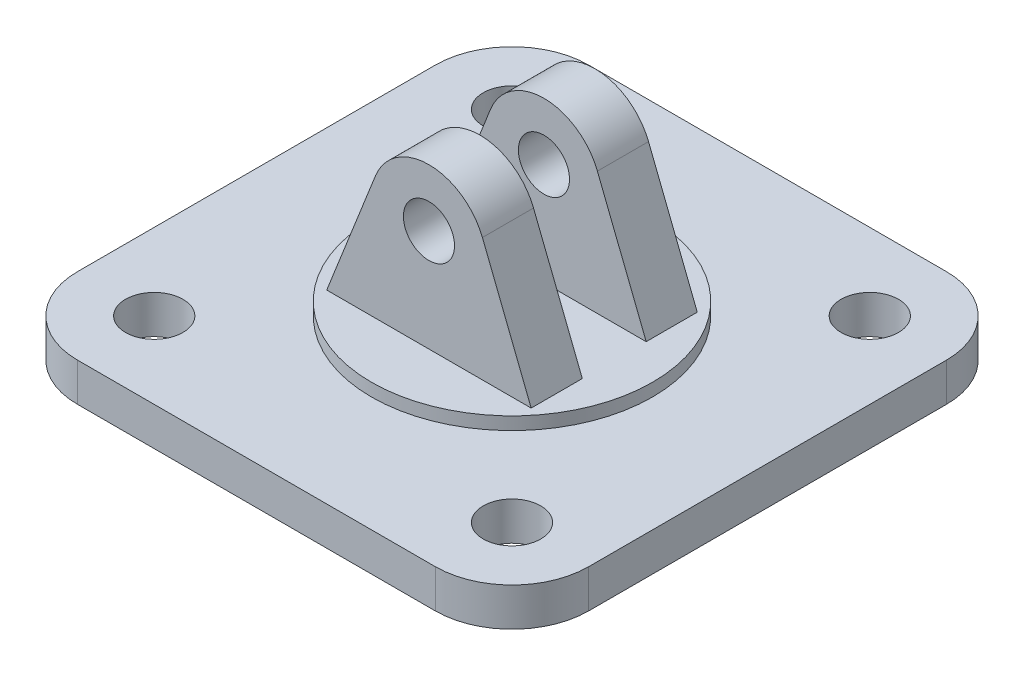
ISO-10303-21;
HEADER;
FILE_DESCRIPTION(('STEP AP214'),'2;1');
FILE_NAME('part.step','',(''),(''),'','','');
FILE_SCHEMA(('AUTOMOTIVE_DESIGN { 1 0 10303 214 1 1 1 1 }'));
ENDSEC;
DATA;
#1=APPLICATION_CONTEXT('core data for automotive mechanical design processes');
#2=APPLICATION_PROTOCOL_DEFINITION('international standard','automotive_design',2000,#1);
#3=PRODUCT_CONTEXT('',#1,'mechanical');
#4=PRODUCT('Part','Part','',(#3));
#5=PRODUCT_RELATED_PRODUCT_CATEGORY('part','',(#4));
#6=PRODUCT_DEFINITION_FORMATION('','',#4);
#7=PRODUCT_DEFINITION_CONTEXT('part definition',#1,'design');
#8=PRODUCT_DEFINITION('design','',#6,#7);
#9=PRODUCT_DEFINITION_SHAPE('','',#8);
#10=(LENGTH_UNIT() NAMED_UNIT(*) SI_UNIT(.MILLI.,.METRE.));
#11=(NAMED_UNIT(*) PLANE_ANGLE_UNIT() SI_UNIT($,.RADIAN.));
#12=(NAMED_UNIT(*) SI_UNIT($,.STERADIAN.) SOLID_ANGLE_UNIT());
#13=UNCERTAINTY_MEASURE_WITH_UNIT(LENGTH_MEASURE(1.E-05),#10,'distance_accuracy_value','');
#14=(GEOMETRIC_REPRESENTATION_CONTEXT(3) GLOBAL_UNCERTAINTY_ASSIGNED_CONTEXT((#13)) GLOBAL_UNIT_ASSIGNED_CONTEXT((#10,
#11,#12)) REPRESENTATION_CONTEXT('',''));
#15=CARTESIAN_POINT('',(0.,0.,0.));
#16=DIRECTION('',(0.,0.,1.));
#17=DIRECTION('',(1.,0.,0.));
#18=AXIS2_PLACEMENT_3D('',#15,#16,#17);
#19=CARTESIAN_POINT('',(-20.,50.,-16.25));
#20=DIRECTION('',(0.,0.,-1.));
#21=DIRECTION('',(-1.,0.,0.));
#22=AXIS2_PLACEMENT_3D('',#19,#20,#21);
#23=PLANE('',#22);
#24=CARTESIAN_POINT('',(0.,30.,-16.25));
#25=DIRECTION('',(0.,0.,1.));
#26=DIRECTION('',(1.,0.,0.));
#27=AXIS2_PLACEMENT_3D('',#24,#25,#26);
#28=CIRCLE('',#27,5.);
#29=CARTESIAN_POINT('',(5.,30.,-16.25));
#30=VERTEX_POINT('',#29);
#31=EDGE_CURVE('E330',#30,#30,#28,.T.);
#32=ORIENTED_EDGE('',*,*,#31,.T.);
#33=EDGE_LOOP('',(#32));
#34=FACE_BOUND('',#33,.T.);
#35=DIRECTION('',(-0.367516859125834,-0.930016859125834,0.));
#36=VECTOR('',#35,1.);
#37=CARTESIAN_POINT('',(-20.7165959151656,8.18662391741718,-16.25));
#38=LINE('',#37,#36);
#39=CARTESIAN_POINT('',(-10.4626896651656,34.1345646651656,-16.25));
#40=VERTEX_POINT('',#39);
#41=CARTESIAN_POINT('',(-20.,10.,-16.25));
#42=VERTEX_POINT('',#41);
#43=EDGE_CURVE('E370',#40,#42,#38,.T.);
#44=ORIENTED_EDGE('',*,*,#43,.F.);
#45=CARTESIAN_POINT('',(0.,30.,-16.25));
#46=DIRECTION('',(0.,0.,1.));
#47=DIRECTION('',(1.,0.,0.));
#48=AXIS2_PLACEMENT_3D('',#45,#46,#47);
#49=CIRCLE('',#48,11.25);
#50=CARTESIAN_POINT('',(10.4626896651656,34.1345646651656,-16.25));
#51=VERTEX_POINT('',#50);
#52=EDGE_CURVE('E349',#51,#40,#49,.T.);
#53=ORIENTED_EDGE('',*,*,#52,.F.);
#54=DIRECTION('',(0.367516859125835,-0.930016859125834,0.));
#55=VECTOR('',#54,1.);
#56=CARTESIAN_POINT('',(20.7165959151656,8.1866239174172,-16.25));
#57=LINE('',#56,#55);
#58=CARTESIAN_POINT('',(20.,10.,-16.25));
#59=VERTEX_POINT('',#58);
#60=EDGE_CURVE('E360',#51,#59,#57,.T.);
#61=ORIENTED_EDGE('',*,*,#60,.T.);
#62=DIRECTION('',(1.,0.,0.));
#63=VECTOR('',#62,1.);
#64=CARTESIAN_POINT('',(-20.,10.,-16.25));
#65=LINE('',#64,#63);
#66=EDGE_CURVE('E385',#42,#59,#65,.T.);
#67=ORIENTED_EDGE('',*,*,#66,.F.);
#68=EDGE_LOOP('',(#44,#53,#61,#67));
#69=FACE_BOUND('',#68,.T.);
#70=ADVANCED_FACE('F87',(#34,#69),#23,.T.);
#71=CARTESIAN_POINT('',(-20.,50.,-6.25));
#72=DIRECTION('',(0.,0.,1.));
#73=DIRECTION('',(1.,0.,0.));
#74=AXIS2_PLACEMENT_3D('',#71,#72,#73);
#75=PLANE('',#74);
#76=CARTESIAN_POINT('',(0.,30.,-6.25));
#77=DIRECTION('',(0.,0.,1.));
#78=DIRECTION('',(1.,0.,0.));
#79=AXIS2_PLACEMENT_3D('',#76,#77,#78);
#80=CIRCLE('',#79,5.);
#81=CARTESIAN_POINT('',(5.,30.,-6.25));
#82=VERTEX_POINT('',#81);
#83=EDGE_CURVE('E344',#82,#82,#80,.T.);
#84=ORIENTED_EDGE('',*,*,#83,.F.);
#85=EDGE_LOOP('',(#84));
#86=FACE_BOUND('',#85,.T.);
#87=DIRECTION('',(0.367516859125835,-0.930016859125834,0.));
#88=VECTOR('',#87,1.);
#89=CARTESIAN_POINT('',(20.7165959151656,8.1866239174172,-6.25));
#90=LINE('',#89,#88);
#91=CARTESIAN_POINT('',(10.4626896651656,34.1345646651656,-6.25));
#92=VERTEX_POINT('',#91);
#93=CARTESIAN_POINT('',(20.,10.,-6.25));
#94=VERTEX_POINT('',#93);
#95=EDGE_CURVE('E359',#92,#94,#90,.T.);
#96=ORIENTED_EDGE('',*,*,#95,.F.);
#97=CARTESIAN_POINT('',(0.,30.,-6.25));
#98=DIRECTION('',(0.,0.,1.));
#99=DIRECTION('',(1.,0.,0.));
#100=AXIS2_PLACEMENT_3D('',#97,#98,#99);
#101=CIRCLE('',#100,11.25);
#102=CARTESIAN_POINT('',(-10.4626896651656,34.1345646651656,-6.25));
#103=VERTEX_POINT('',#102);
#104=EDGE_CURVE('E355',#92,#103,#101,.T.);
#105=ORIENTED_EDGE('',*,*,#104,.T.);
#106=DIRECTION('',(-0.367516859125834,-0.930016859125834,0.));
#107=VECTOR('',#106,1.);
#108=CARTESIAN_POINT('',(-20.7165959151656,8.18662391741718,-6.25));
#109=LINE('',#108,#107);
#110=CARTESIAN_POINT('',(-20.,10.,-6.25));
#111=VERTEX_POINT('',#110);
#112=EDGE_CURVE('E115',#103,#111,#109,.T.);
#113=ORIENTED_EDGE('',*,*,#112,.T.);
#114=DIRECTION('',(-1.,0.,0.));
#115=VECTOR('',#114,1.);
#116=CARTESIAN_POINT('',(-20.,10.,-6.25));
#117=LINE('',#116,#115);
#118=EDGE_CURVE('E388',#94,#111,#117,.T.);
#119=ORIENTED_EDGE('',*,*,#118,.F.);
#120=EDGE_LOOP('',(#96,#105,#113,#119));
#121=FACE_BOUND('',#120,.T.);
#122=ADVANCED_FACE('F609',(#86,#121),#75,.T.);
#123=CARTESIAN_POINT('',(-20.,50.,6.25));
#124=DIRECTION('',(0.,0.,1.));
#125=DIRECTION('',(1.,0.,0.));
#126=AXIS2_PLACEMENT_3D('',#123,#124,#125);
#127=PLANE('',#126);
#128=CARTESIAN_POINT('',(0.,30.,6.25));
#129=DIRECTION('',(0.,0.,1.));
#130=DIRECTION('',(1.,0.,0.));
#131=AXIS2_PLACEMENT_3D('',#128,#129,#130);
#132=CIRCLE('',#131,5.);
#133=CARTESIAN_POINT('',(5.,30.,6.25));
#134=VERTEX_POINT('',#133);
#135=EDGE_CURVE('E393',#134,#134,#132,.T.);
#136=ORIENTED_EDGE('',*,*,#135,.T.);
#137=EDGE_LOOP('',(#136));
#138=FACE_BOUND('',#137,.T.);
#139=DIRECTION('',(-0.367516859125834,-0.930016859125834,0.));
#140=VECTOR('',#139,1.);
#141=CARTESIAN_POINT('',(-20.7165959151656,8.18662391741718,6.25));
#142=LINE('',#141,#140);
#143=CARTESIAN_POINT('',(-10.4626896651656,34.1345646651656,6.25));
#144=VERTEX_POINT('',#143);
#145=CARTESIAN_POINT('',(-20.,10.,6.25));
#146=VERTEX_POINT('',#145);
#147=EDGE_CURVE('E411',#144,#146,#142,.T.);
#148=ORIENTED_EDGE('',*,*,#147,.F.);
#149=CARTESIAN_POINT('',(0.,30.,6.25));
#150=DIRECTION('',(0.,0.,1.));
#151=DIRECTION('',(1.,0.,0.));
#152=AXIS2_PLACEMENT_3D('',#149,#150,#151);
#153=CIRCLE('',#152,11.25);
#154=CARTESIAN_POINT('',(10.4626896651656,34.1345646651656,6.25));
#155=VERTEX_POINT('',#154);
#156=EDGE_CURVE('E401',#155,#144,#153,.T.);
#157=ORIENTED_EDGE('',*,*,#156,.F.);
#158=DIRECTION('',(0.367516859125835,-0.930016859125834,0.));
#159=VECTOR('',#158,1.);
#160=CARTESIAN_POINT('',(20.7165959151656,8.1866239174172,6.25));
#161=LINE('',#160,#159);
#162=CARTESIAN_POINT('',(20.,10.,6.25));
#163=VERTEX_POINT('',#162);
#164=EDGE_CURVE('E407',#155,#163,#161,.T.);
#165=ORIENTED_EDGE('',*,*,#164,.T.);
#166=DIRECTION('',(-1.,0.,0.));
#167=VECTOR('',#166,1.);
#168=CARTESIAN_POINT('',(-20.,10.,6.25));
#169=LINE('',#168,#167);
#170=EDGE_CURVE('E435',#163,#146,#169,.T.);
#171=ORIENTED_EDGE('',*,*,#170,.T.);
#172=EDGE_LOOP('',(#148,#157,#165,#171));
#173=FACE_BOUND('',#172,.T.);
#174=ADVANCED_FACE('F613',(#138,#173),#127,.F.);
#175=CARTESIAN_POINT('',(-20.,50.,16.25));
#176=DIRECTION('',(0.,0.,-1.));
#177=DIRECTION('',(-1.,0.,0.));
#178=AXIS2_PLACEMENT_3D('',#175,#176,#177);
#179=PLANE('',#178);
#180=CARTESIAN_POINT('',(0.,30.,16.25));
#181=DIRECTION('',(0.,0.,1.));
#182=DIRECTION('',(1.,0.,0.));
#183=AXIS2_PLACEMENT_3D('',#180,#181,#182);
#184=CIRCLE('',#183,5.);
#185=CARTESIAN_POINT('',(5.,30.,16.25));
#186=VERTEX_POINT('',#185);
#187=EDGE_CURVE('E391',#186,#186,#184,.T.);
#188=ORIENTED_EDGE('',*,*,#187,.F.);
#189=EDGE_LOOP('',(#188));
#190=FACE_BOUND('',#189,.T.);
#191=DIRECTION('',(0.367516859125835,-0.930016859125834,0.));
#192=VECTOR('',#191,1.);
#193=CARTESIAN_POINT('',(20.7165959151656,8.1866239174172,16.25));
#194=LINE('',#193,#192);
#195=CARTESIAN_POINT('',(10.4626896651656,34.1345646651656,16.25));
#196=VERTEX_POINT('',#195);
#197=CARTESIAN_POINT('',(20.,10.,16.25));
#198=VERTEX_POINT('',#197);
#199=EDGE_CURVE('E416',#196,#198,#194,.T.);
#200=ORIENTED_EDGE('',*,*,#199,.F.);
#201=CARTESIAN_POINT('',(0.,30.,16.25));
#202=DIRECTION('',(0.,0.,1.));
#203=DIRECTION('',(1.,0.,0.));
#204=AXIS2_PLACEMENT_3D('',#201,#202,#203);
#205=CIRCLE('',#204,11.25);
#206=CARTESIAN_POINT('',(-10.4626896651656,34.1345646651656,16.25));
#207=VERTEX_POINT('',#206);
#208=EDGE_CURVE('E398',#196,#207,#205,.T.);
#209=ORIENTED_EDGE('',*,*,#208,.T.);
#210=DIRECTION('',(-0.367516859125834,-0.930016859125834,0.));
#211=VECTOR('',#210,1.);
#212=CARTESIAN_POINT('',(-20.7165959151656,8.18662391741718,16.25));
#213=LINE('',#212,#211);
#214=CARTESIAN_POINT('',(-20.,10.,16.25));
#215=VERTEX_POINT('',#214);
#216=EDGE_CURVE('E409',#207,#215,#213,.T.);
#217=ORIENTED_EDGE('',*,*,#216,.T.);
#218=DIRECTION('',(1.,0.,0.));
#219=VECTOR('',#218,1.);
#220=CARTESIAN_POINT('',(-20.,10.,16.25));
#221=LINE('',#220,#219);
#222=EDGE_CURVE('E438',#215,#198,#221,.T.);
#223=ORIENTED_EDGE('',*,*,#222,.T.);
#224=EDGE_LOOP('',(#200,#209,#217,#223));
#225=FACE_BOUND('',#224,.T.);
#226=ADVANCED_FACE('F636',(#190,#225),#179,.F.);
#227=CARTESIAN_POINT('',(50.,7.5,50.));
#228=DIRECTION('',(-1.,0.,0.));
#229=DIRECTION('',(0.,0.,1.));
#230=AXIS2_PLACEMENT_3D('',#227,#228,#229);
#231=PLANE('',#230);
#232=DIRECTION('',(0.,0.,-1.));
#233=VECTOR('',#232,1.);
#234=CARTESIAN_POINT('',(50.,0.,50.));
#235=LINE('',#234,#233);
#236=CARTESIAN_POINT('',(50.,0.,35.));
#237=VERTEX_POINT('',#236);
#238=CARTESIAN_POINT('',(50.,0.,-35.));
#239=VERTEX_POINT('',#238);
#240=EDGE_CURVE('E478',#237,#239,#235,.T.);
#241=ORIENTED_EDGE('',*,*,#240,.T.);
#242=DIRECTION('',(0.,-1.,0.));
#243=VECTOR('',#242,1.);
#244=CARTESIAN_POINT('',(50.,7.5,-35.));
#245=LINE('',#244,#243);
#246=CARTESIAN_POINT('',(50.,7.5,-35.));
#247=VERTEX_POINT('',#246);
#248=EDGE_CURVE('E554',#239,#247,#245,.F.);
#249=ORIENTED_EDGE('',*,*,#248,.T.);
#250=DIRECTION('',(0.,0.,-1.));
#251=VECTOR('',#250,1.);
#252=CARTESIAN_POINT('',(50.,7.5,50.));
#253=LINE('',#252,#251);
#254=CARTESIAN_POINT('',(50.,7.5,35.));
#255=VERTEX_POINT('',#254);
#256=EDGE_CURVE('E477',#255,#247,#253,.T.);
#257=ORIENTED_EDGE('',*,*,#256,.F.);
#258=DIRECTION('',(0.,-1.,0.));
#259=VECTOR('',#258,1.);
#260=CARTESIAN_POINT('',(50.,7.5,35.));
#261=LINE('',#260,#259);
#262=EDGE_CURVE('E548',#255,#237,#261,.T.);
#263=ORIENTED_EDGE('',*,*,#262,.T.);
#264=EDGE_LOOP('',(#241,#249,#257,#263));
#265=FACE_BOUND('',#264,.T.);
#266=ADVANCED_FACE('F573',(#265),#231,.F.);
#267=CARTESIAN_POINT('',(-50.,7.5,-50.));
#268=DIRECTION('',(0.,0.,1.));
#269=DIRECTION('',(1.,0.,0.));
#270=AXIS2_PLACEMENT_3D('',#267,#268,#269);
#271=PLANE('',#270);
#272=DIRECTION('',(-1.,0.,0.));
#273=VECTOR('',#272,1.);
#274=CARTESIAN_POINT('',(-50.,0.,-50.));
#275=LINE('',#274,#273);
#276=CARTESIAN_POINT('',(35.,0.,-50.));
#277=VERTEX_POINT('',#276);
#278=CARTESIAN_POINT('',(-35.,0.,-50.));
#279=VERTEX_POINT('',#278);
#280=EDGE_CURVE('E502',#277,#279,#275,.T.);
#281=ORIENTED_EDGE('',*,*,#280,.T.);
#282=DIRECTION('',(0.,-1.,0.));
#283=VECTOR('',#282,1.);
#284=CARTESIAN_POINT('',(-35.,7.5,-50.));
#285=LINE('',#284,#283);
#286=CARTESIAN_POINT('',(-35.,7.5,-50.));
#287=VERTEX_POINT('',#286);
#288=EDGE_CURVE('E534',#279,#287,#285,.F.);
#289=ORIENTED_EDGE('',*,*,#288,.T.);
#290=DIRECTION('',(-1.,0.,0.));
#291=VECTOR('',#290,1.);
#292=CARTESIAN_POINT('',(-50.,7.5,-50.));
#293=LINE('',#292,#291);
#294=CARTESIAN_POINT('',(35.,7.5,-50.));
#295=VERTEX_POINT('',#294);
#296=EDGE_CURVE('E482',#295,#287,#293,.T.);
#297=ORIENTED_EDGE('',*,*,#296,.F.);
#298=DIRECTION('',(0.,-1.,0.));
#299=VECTOR('',#298,1.);
#300=CARTESIAN_POINT('',(35.,7.5,-50.));
#301=LINE('',#300,#299);
#302=EDGE_CURVE('E529',#295,#277,#301,.T.);
#303=ORIENTED_EDGE('',*,*,#302,.T.);
#304=EDGE_LOOP('',(#281,#289,#297,#303));
#305=FACE_BOUND('',#304,.T.);
#306=ADVANCED_FACE('F590',(#305),#271,.F.);
#307=CARTESIAN_POINT('',(-50.,7.5,50.));
#308=DIRECTION('',(1.,0.,0.));
#309=DIRECTION('',(0.,0.,-1.));
#310=AXIS2_PLACEMENT_3D('',#307,#308,#309);
#311=PLANE('',#310);
#312=DIRECTION('',(0.,0.,1.));
#313=VECTOR('',#312,1.);
#314=CARTESIAN_POINT('',(-50.,7.5,50.));
#315=LINE('',#314,#313);
#316=CARTESIAN_POINT('',(-50.,7.5,-35.));
#317=VERTEX_POINT('',#316);
#318=CARTESIAN_POINT('',(-50.,7.5,35.));
#319=VERTEX_POINT('',#318);
#320=EDGE_CURVE('E487',#317,#319,#315,.T.);
#321=ORIENTED_EDGE('',*,*,#320,.F.);
#322=DIRECTION('',(0.,-1.,0.));
#323=VECTOR('',#322,1.);
#324=CARTESIAN_POINT('',(-50.,7.5,-35.));
#325=LINE('',#324,#323);
#326=CARTESIAN_POINT('',(-50.,0.,-35.));
#327=VERTEX_POINT('',#326);
#328=EDGE_CURVE('E514',#317,#327,#325,.T.);
#329=ORIENTED_EDGE('',*,*,#328,.T.);
#330=DIRECTION('',(0.,0.,1.));
#331=VECTOR('',#330,1.);
#332=CARTESIAN_POINT('',(-50.,0.,50.));
#333=LINE('',#332,#331);
#334=CARTESIAN_POINT('',(-50.,0.,35.));
#335=VERTEX_POINT('',#334);
#336=EDGE_CURVE('E503',#327,#335,#333,.T.);
#337=ORIENTED_EDGE('',*,*,#336,.T.);
#338=DIRECTION('',(0.,-1.,0.));
#339=VECTOR('',#338,1.);
#340=CARTESIAN_POINT('',(-50.,7.5,35.));
#341=LINE('',#340,#339);
#342=EDGE_CURVE('E500',#335,#319,#341,.F.);
#343=ORIENTED_EDGE('',*,*,#342,.T.);
#344=EDGE_LOOP('',(#321,#329,#337,#343));
#345=FACE_BOUND('',#344,.T.);
#346=ADVANCED_FACE('F594',(#345),#311,.F.);
#347=CARTESIAN_POINT('',(-50.,7.5,50.));
#348=DIRECTION('',(0.,0.,-1.));
#349=DIRECTION('',(-1.,0.,0.));
#350=AXIS2_PLACEMENT_3D('',#347,#348,#349);
#351=PLANE('',#350);
#352=DIRECTION('',(1.,0.,0.));
#353=VECTOR('',#352,1.);
#354=CARTESIAN_POINT('',(-50.,0.,50.));
#355=LINE('',#354,#353);
#356=CARTESIAN_POINT('',(-35.,0.,50.));
#357=VERTEX_POINT('',#356);
#358=CARTESIAN_POINT('',(35.,0.,50.));
#359=VERTEX_POINT('',#358);
#360=EDGE_CURVE('E484',#357,#359,#355,.T.);
#361=ORIENTED_EDGE('',*,*,#360,.T.);
#362=DIRECTION('',(0.,-1.,0.));
#363=VECTOR('',#362,1.);
#364=CARTESIAN_POINT('',(35.,7.5,50.));
#365=LINE('',#364,#363);
#366=CARTESIAN_POINT('',(35.,7.5,50.));
#367=VERTEX_POINT('',#366);
#368=EDGE_CURVE('E93',#359,#367,#365,.F.);
#369=ORIENTED_EDGE('',*,*,#368,.T.);
#370=DIRECTION('',(1.,0.,0.));
#371=VECTOR('',#370,1.);
#372=CARTESIAN_POINT('',(-50.,7.5,50.));
#373=LINE('',#372,#371);
#374=CARTESIAN_POINT('',(-35.,7.5,50.));
#375=VERTEX_POINT('',#374);
#376=EDGE_CURVE('E492',#375,#367,#373,.T.);
#377=ORIENTED_EDGE('',*,*,#376,.F.);
#378=DIRECTION('',(0.,-1.,0.));
#379=VECTOR('',#378,1.);
#380=CARTESIAN_POINT('',(-35.,7.5,50.));
#381=LINE('',#380,#379);
#382=EDGE_CURVE('E553',#375,#357,#381,.T.);
#383=ORIENTED_EDGE('',*,*,#382,.T.);
#384=EDGE_LOOP('',(#361,#369,#377,#383));
#385=FACE_BOUND('',#384,.T.);
#386=ADVANCED_FACE('F563',(#385),#351,.F.);
#387=CARTESIAN_POINT('',(0.,7.5,0.));
#388=DIRECTION('',(0.,-1.,0.));
#389=DIRECTION('',(0.,0.,-1.));
#390=AXIS2_PLACEMENT_3D('',#387,#388,#389);
#391=PLANE('',#390);
#392=CARTESIAN_POINT('',(0.,7.5,0.));
#393=DIRECTION('',(0.,1.,0.));
#394=DIRECTION('',(0.,0.,1.));
#395=AXIS2_PLACEMENT_3D('',#392,#393,#394);
#396=CIRCLE('',#395,27.5);
#397=CARTESIAN_POINT('',(0.,7.5,27.5));
#398=VERTEX_POINT('',#397);
#399=EDGE_CURVE('E12',#398,#398,#396,.T.);
#400=ORIENTED_EDGE('',*,*,#399,.F.);
#401=EDGE_LOOP('',(#400));
#402=FACE_BOUND('',#401,.T.);
#403=CARTESIAN_POINT('',(-35.,7.5,35.));
#404=DIRECTION('',(0.,1.,0.));
#405=DIRECTION('',(0.,0.,-1.));
#406=AXIS2_PLACEMENT_3D('',#403,#404,#405);
#407=CIRCLE('',#406,5.625);
#408=CARTESIAN_POINT('',(-35.,7.5,29.375));
#409=VERTEX_POINT('',#408);
#410=EDGE_CURVE('E463',#409,#409,#407,.T.);
#411=ORIENTED_EDGE('',*,*,#410,.F.);
#412=EDGE_LOOP('',(#411));
#413=FACE_BOUND('',#412,.T.);
#414=CARTESIAN_POINT('',(35.,7.5,35.));
#415=DIRECTION('',(0.,1.,0.));
#416=DIRECTION('',(0.,0.,1.));
#417=AXIS2_PLACEMENT_3D('',#414,#415,#416);
#418=CIRCLE('',#417,5.625);
#419=CARTESIAN_POINT('',(35.,7.5,40.625));
#420=VERTEX_POINT('',#419);
#421=EDGE_CURVE('E460',#420,#420,#418,.T.);
#422=ORIENTED_EDGE('',*,*,#421,.F.);
#423=EDGE_LOOP('',(#422));
#424=FACE_BOUND('',#423,.T.);
#425=CARTESIAN_POINT('',(35.,7.5,-35.));
#426=DIRECTION('',(0.,1.,0.));
#427=DIRECTION('',(0.,0.,-1.));
#428=AXIS2_PLACEMENT_3D('',#425,#426,#427);
#429=CIRCLE('',#428,5.625);
#430=CARTESIAN_POINT('',(35.,7.5,-40.625));
#431=VERTEX_POINT('',#430);
#432=EDGE_CURVE('E450',#431,#431,#429,.T.);
#433=ORIENTED_EDGE('',*,*,#432,.F.);
#434=EDGE_LOOP('',(#433));
#435=FACE_BOUND('',#434,.T.);
#436=CARTESIAN_POINT('',(-35.,7.5,-35.));
#437=DIRECTION('',(0.,1.,0.));
#438=DIRECTION('',(0.,0.,1.));
#439=AXIS2_PLACEMENT_3D('',#436,#437,#438);
#440=CIRCLE('',#439,5.625);
#441=CARTESIAN_POINT('',(-35.,7.5,-29.375));
#442=VERTEX_POINT('',#441);
#443=EDGE_CURVE('E455',#442,#442,#440,.T.);
#444=ORIENTED_EDGE('',*,*,#443,.F.);
#445=EDGE_LOOP('',(#444));
#446=FACE_BOUND('',#445,.T.);
#447=ORIENTED_EDGE('',*,*,#296,.T.);
#448=CARTESIAN_POINT('',(-35.,7.5,-35.));
#449=DIRECTION('',(0.,-1.,0.));
#450=DIRECTION('',(0.,0.,-1.));
#451=AXIS2_PLACEMENT_3D('',#448,#449,#450);
#452=CIRCLE('',#451,15.);
#453=EDGE_CURVE('E546',#287,#317,#452,.F.);
#454=ORIENTED_EDGE('',*,*,#453,.T.);
#455=ORIENTED_EDGE('',*,*,#320,.T.);
#456=CARTESIAN_POINT('',(-35.,7.5,35.));
#457=DIRECTION('',(0.,-1.,0.));
#458=DIRECTION('',(0.,0.,-1.));
#459=AXIS2_PLACEMENT_3D('',#456,#457,#458);
#460=CIRCLE('',#459,15.);
#461=EDGE_CURVE('E540',#319,#375,#460,.F.);
#462=ORIENTED_EDGE('',*,*,#461,.T.);
#463=ORIENTED_EDGE('',*,*,#376,.T.);
#464=CARTESIAN_POINT('',(35.,7.5,35.));
#465=DIRECTION('',(0.,-1.,0.));
#466=DIRECTION('',(0.,0.,-1.));
#467=AXIS2_PLACEMENT_3D('',#464,#465,#466);
#468=CIRCLE('',#467,15.);
#469=EDGE_CURVE('E539',#367,#255,#468,.F.);
#470=ORIENTED_EDGE('',*,*,#469,.T.);
#471=ORIENTED_EDGE('',*,*,#256,.T.);
#472=CARTESIAN_POINT('',(35.,7.5,-35.));
#473=DIRECTION('',(0.,-1.,0.));
#474=DIRECTION('',(0.,0.,-1.));
#475=AXIS2_PLACEMENT_3D('',#472,#473,#474);
#476=CIRCLE('',#475,15.);
#477=EDGE_CURVE('E543',#247,#295,#476,.F.);
#478=ORIENTED_EDGE('',*,*,#477,.T.);
#479=EDGE_LOOP('',(#447,#454,#455,#462,#463,#470,#471,#478));
#480=FACE_BOUND('',#479,.T.);
#481=ADVANCED_FACE('F566',(#402,#413,#424,#435,#446,#480),#391,.F.);
#482=CARTESIAN_POINT('',(0.,0.,0.));
#483=DIRECTION('',(0.,-1.,0.));
#484=DIRECTION('',(0.,0.,-1.));
#485=AXIS2_PLACEMENT_3D('',#482,#483,#484);
#486=PLANE('',#485);
#487=CARTESIAN_POINT('',(-20.,0.,-20.));
#488=DIRECTION('',(0.,-1.,0.));
#489=DIRECTION('',(0.,0.,1.));
#490=AXIS2_PLACEMENT_3D('',#487,#488,#489);
#491=CIRCLE('',#490,5.);
#492=CARTESIAN_POINT('',(-25.,0.,-20.));
#493=VERTEX_POINT('',#492);
#494=CARTESIAN_POINT('',(-20.,0.,-25.));
#495=VERTEX_POINT('',#494);
#496=EDGE_CURVE('E102',#493,#495,#491,.T.);
#497=ORIENTED_EDGE('',*,*,#496,.F.);
#498=DIRECTION('',(0.,0.,-1.));
#499=VECTOR('',#498,1.);
#500=CARTESIAN_POINT('',(-25.,0.,-20.));
#501=LINE('',#500,#499);
#502=CARTESIAN_POINT('',(-25.,0.,20.));
#503=VERTEX_POINT('',#502);
#504=EDGE_CURVE('E273',#503,#493,#501,.T.);
#505=ORIENTED_EDGE('',*,*,#504,.F.);
#506=CARTESIAN_POINT('',(-20.,0.,20.));
#507=DIRECTION('',(0.,-1.,0.));
#508=DIRECTION('',(0.,0.,-1.));
#509=AXIS2_PLACEMENT_3D('',#506,#507,#508);
#510=CIRCLE('',#509,5.);
#511=CARTESIAN_POINT('',(-20.,0.,25.));
#512=VERTEX_POINT('',#511);
#513=EDGE_CURVE('E279',#512,#503,#510,.T.);
#514=ORIENTED_EDGE('',*,*,#513,.F.);
#515=DIRECTION('',(-1.,0.,0.));
#516=VECTOR('',#515,1.);
#517=CARTESIAN_POINT('',(-20.,0.,25.));
#518=LINE('',#517,#516);
#519=CARTESIAN_POINT('',(20.,0.,25.));
#520=VERTEX_POINT('',#519);
#521=EDGE_CURVE('E320',#520,#512,#518,.T.);
#522=ORIENTED_EDGE('',*,*,#521,.F.);
#523=CARTESIAN_POINT('',(20.,0.,20.));
#524=DIRECTION('',(0.,-1.,0.));
#525=DIRECTION('',(0.,0.,-1.));
#526=AXIS2_PLACEMENT_3D('',#523,#524,#525);
#527=CIRCLE('',#526,5.);
#528=CARTESIAN_POINT('',(25.,0.,20.));
#529=VERTEX_POINT('',#528);
#530=EDGE_CURVE('E311',#529,#520,#527,.T.);
#531=ORIENTED_EDGE('',*,*,#530,.F.);
#532=DIRECTION('',(0.,0.,1.));
#533=VECTOR('',#532,1.);
#534=CARTESIAN_POINT('',(25.,0.,-20.));
#535=LINE('',#534,#533);
#536=CARTESIAN_POINT('',(25.,0.,-20.));
#537=VERTEX_POINT('',#536);
#538=EDGE_CURVE('E310',#537,#529,#535,.T.);
#539=ORIENTED_EDGE('',*,*,#538,.F.);
#540=CARTESIAN_POINT('',(20.,0.,-20.));
#541=DIRECTION('',(0.,-1.,0.));
#542=DIRECTION('',(0.,0.,-1.));
#543=AXIS2_PLACEMENT_3D('',#540,#541,#542);
#544=CIRCLE('',#543,5.);
#545=CARTESIAN_POINT('',(20.,0.,-25.));
#546=VERTEX_POINT('',#545);
#547=EDGE_CURVE('E304',#546,#537,#544,.T.);
#548=ORIENTED_EDGE('',*,*,#547,.F.);
#549=DIRECTION('',(1.,0.,0.));
#550=VECTOR('',#549,1.);
#551=CARTESIAN_POINT('',(-20.,0.,-25.));
#552=LINE('',#551,#550);
#553=EDGE_CURVE('E305',#495,#546,#552,.T.);
#554=ORIENTED_EDGE('',*,*,#553,.F.);
#555=EDGE_LOOP('',(#497,#505,#514,#522,#531,#539,#548,#554));
#556=FACE_BOUND('',#555,.T.);
#557=CARTESIAN_POINT('',(-35.,0.,35.));
#558=DIRECTION('',(0.,1.,0.));
#559=DIRECTION('',(0.,0.,-1.));
#560=AXIS2_PLACEMENT_3D('',#557,#558,#559);
#561=CIRCLE('',#560,5.625);
#562=CARTESIAN_POINT('',(-35.,0.,29.375));
#563=VERTEX_POINT('',#562);
#564=EDGE_CURVE('E447',#563,#563,#561,.T.);
#565=ORIENTED_EDGE('',*,*,#564,.T.);
#566=EDGE_LOOP('',(#565));
#567=FACE_BOUND('',#566,.T.);
#568=CARTESIAN_POINT('',(35.,0.,35.));
#569=DIRECTION('',(0.,1.,0.));
#570=DIRECTION('',(0.,0.,1.));
#571=AXIS2_PLACEMENT_3D('',#568,#569,#570);
#572=CIRCLE('',#571,5.625);
#573=CARTESIAN_POINT('',(35.,0.,40.625));
#574=VERTEX_POINT('',#573);
#575=EDGE_CURVE('E462',#574,#574,#572,.T.);
#576=ORIENTED_EDGE('',*,*,#575,.T.);
#577=EDGE_LOOP('',(#576));
#578=FACE_BOUND('',#577,.T.);
#579=CARTESIAN_POINT('',(35.,0.,-35.));
#580=DIRECTION('',(0.,1.,0.));
#581=DIRECTION('',(0.,0.,-1.));
#582=AXIS2_PLACEMENT_3D('',#579,#580,#581);
#583=CIRCLE('',#582,5.625);
#584=CARTESIAN_POINT('',(35.,0.,-40.625));
#585=VERTEX_POINT('',#584);
#586=EDGE_CURVE('E452',#585,#585,#583,.T.);
#587=ORIENTED_EDGE('',*,*,#586,.T.);
#588=EDGE_LOOP('',(#587));
#589=FACE_BOUND('',#588,.T.);
#590=CARTESIAN_POINT('',(-35.,0.,-35.));
#591=DIRECTION('',(0.,1.,0.));
#592=DIRECTION('',(0.,0.,1.));
#593=AXIS2_PLACEMENT_3D('',#590,#591,#592);
#594=CIRCLE('',#593,5.625);
#595=CARTESIAN_POINT('',(-35.,0.,-29.375));
#596=VERTEX_POINT('',#595);
#597=EDGE_CURVE('E472',#596,#596,#594,.T.);
#598=ORIENTED_EDGE('',*,*,#597,.T.);
#599=EDGE_LOOP('',(#598));
#600=FACE_BOUND('',#599,.T.);
#601=ORIENTED_EDGE('',*,*,#336,.F.);
#602=CARTESIAN_POINT('',(-35.,0.,-35.));
#603=DIRECTION('',(0.,-1.,0.));
#604=DIRECTION('',(0.,0.,-1.));
#605=AXIS2_PLACEMENT_3D('',#602,#603,#604);
#606=CIRCLE('',#605,15.);
#607=EDGE_CURVE('E527',#327,#279,#606,.T.);
#608=ORIENTED_EDGE('',*,*,#607,.T.);
#609=ORIENTED_EDGE('',*,*,#280,.F.);
#610=CARTESIAN_POINT('',(35.,0.,-35.));
#611=DIRECTION('',(0.,-1.,0.));
#612=DIRECTION('',(0.,0.,-1.));
#613=AXIS2_PLACEMENT_3D('',#610,#611,#612);
#614=CIRCLE('',#613,15.);
#615=EDGE_CURVE('E523',#277,#239,#614,.T.);
#616=ORIENTED_EDGE('',*,*,#615,.T.);
#617=ORIENTED_EDGE('',*,*,#240,.F.);
#618=CARTESIAN_POINT('',(35.,0.,35.));
#619=DIRECTION('',(0.,-1.,0.));
#620=DIRECTION('',(0.,0.,-1.));
#621=AXIS2_PLACEMENT_3D('',#618,#619,#620);
#622=CIRCLE('',#621,15.);
#623=EDGE_CURVE('E521',#237,#359,#622,.T.);
#624=ORIENTED_EDGE('',*,*,#623,.T.);
#625=ORIENTED_EDGE('',*,*,#360,.F.);
#626=CARTESIAN_POINT('',(-35.,0.,35.));
#627=DIRECTION('',(0.,-1.,0.));
#628=DIRECTION('',(0.,0.,-1.));
#629=AXIS2_PLACEMENT_3D('',#626,#627,#628);
#630=CIRCLE('',#629,15.);
#631=EDGE_CURVE('E520',#357,#335,#630,.T.);
#632=ORIENTED_EDGE('',*,*,#631,.T.);
#633=EDGE_LOOP('',(#601,#608,#609,#616,#617,#624,#625,#632));
#634=FACE_BOUND('',#633,.T.);
#635=ADVANCED_FACE('F578',(#556,#567,#578,#589,#600,#634),#486,.T.);
#636=CARTESIAN_POINT('',(-35.,7.5,-35.));
#637=DIRECTION('',(0.,-1.,0.));
#638=DIRECTION('',(0.,0.,-1.));
#639=AXIS2_PLACEMENT_3D('',#636,#637,#638);
#640=CYLINDRICAL_SURFACE('',#639,15.);
#641=ORIENTED_EDGE('',*,*,#453,.F.);
#642=ORIENTED_EDGE('',*,*,#288,.F.);
#643=ORIENTED_EDGE('',*,*,#607,.F.);
#644=ORIENTED_EDGE('',*,*,#328,.F.);
#645=EDGE_LOOP('',(#641,#642,#643,#644));
#646=FACE_BOUND('',#645,.T.);
#647=ADVANCED_FACE('F593',(#646),#640,.T.);
#648=CARTESIAN_POINT('',(35.,7.5,-35.));
#649=DIRECTION('',(0.,-1.,0.));
#650=DIRECTION('',(0.,0.,-1.));
#651=AXIS2_PLACEMENT_3D('',#648,#649,#650);
#652=CYLINDRICAL_SURFACE('',#651,15.);
#653=ORIENTED_EDGE('',*,*,#477,.F.);
#654=ORIENTED_EDGE('',*,*,#248,.F.);
#655=ORIENTED_EDGE('',*,*,#615,.F.);
#656=ORIENTED_EDGE('',*,*,#302,.F.);
#657=EDGE_LOOP('',(#653,#654,#655,#656));
#658=FACE_BOUND('',#657,.T.);
#659=ADVANCED_FACE('F585',(#658),#652,.T.);
#660=CARTESIAN_POINT('',(35.,7.5,35.));
#661=DIRECTION('',(0.,-1.,0.));
#662=DIRECTION('',(0.,0.,-1.));
#663=AXIS2_PLACEMENT_3D('',#660,#661,#662);
#664=CYLINDRICAL_SURFACE('',#663,15.);
#665=ORIENTED_EDGE('',*,*,#469,.F.);
#666=ORIENTED_EDGE('',*,*,#368,.F.);
#667=ORIENTED_EDGE('',*,*,#623,.F.);
#668=ORIENTED_EDGE('',*,*,#262,.F.);
#669=EDGE_LOOP('',(#665,#666,#667,#668));
#670=FACE_BOUND('',#669,.T.);
#671=ADVANCED_FACE('F574',(#670),#664,.T.);
#672=CARTESIAN_POINT('',(-35.,7.5,35.));
#673=DIRECTION('',(0.,-1.,0.));
#674=DIRECTION('',(0.,0.,-1.));
#675=AXIS2_PLACEMENT_3D('',#672,#673,#674);
#676=CYLINDRICAL_SURFACE('',#675,15.);
#677=ORIENTED_EDGE('',*,*,#461,.F.);
#678=ORIENTED_EDGE('',*,*,#342,.F.);
#679=ORIENTED_EDGE('',*,*,#631,.F.);
#680=ORIENTED_EDGE('',*,*,#382,.F.);
#681=EDGE_LOOP('',(#677,#678,#679,#680));
#682=FACE_BOUND('',#681,.T.);
#683=ADVANCED_FACE('F90',(#682),#676,.T.);
#684=CARTESIAN_POINT('',(-35.,0.,-35.));
#685=DIRECTION('',(0.,1.,0.));
#686=DIRECTION('',(0.,0.,1.));
#687=AXIS2_PLACEMENT_3D('',#684,#685,#686);
#688=CYLINDRICAL_SURFACE('',#687,5.625);
#689=ORIENTED_EDGE('',*,*,#597,.F.);
#690=EDGE_LOOP('',(#689));
#691=FACE_BOUND('',#690,.T.);
#692=ORIENTED_EDGE('',*,*,#443,.T.);
#693=EDGE_LOOP('',(#692));
#694=FACE_BOUND('',#693,.T.);
#695=ADVANCED_FACE('F597',(#691,#694),#688,.F.);
#696=CARTESIAN_POINT('',(35.,0.,-35.));
#697=DIRECTION('',(0.,1.,0.));
#698=DIRECTION('',(0.,0.,1.));
#699=AXIS2_PLACEMENT_3D('',#696,#697,#698);
#700=CYLINDRICAL_SURFACE('',#699,5.625);
#701=ORIENTED_EDGE('',*,*,#586,.F.);
#702=EDGE_LOOP('',(#701));
#703=FACE_BOUND('',#702,.T.);
#704=ORIENTED_EDGE('',*,*,#432,.T.);
#705=EDGE_LOOP('',(#704));
#706=FACE_BOUND('',#705,.T.);
#707=ADVANCED_FACE('F603',(#703,#706),#700,.F.);
#708=CARTESIAN_POINT('',(35.,0.,35.));
#709=DIRECTION('',(0.,1.,0.));
#710=DIRECTION('',(0.,0.,1.));
#711=AXIS2_PLACEMENT_3D('',#708,#709,#710);
#712=CYLINDRICAL_SURFACE('',#711,5.625);
#713=ORIENTED_EDGE('',*,*,#575,.F.);
#714=EDGE_LOOP('',(#713));
#715=FACE_BOUND('',#714,.T.);
#716=ORIENTED_EDGE('',*,*,#421,.T.);
#717=EDGE_LOOP('',(#716));
#718=FACE_BOUND('',#717,.T.);
#719=ADVANCED_FACE('F654',(#715,#718),#712,.F.);
#720=CARTESIAN_POINT('',(-35.,0.,35.));
#721=DIRECTION('',(0.,1.,0.));
#722=DIRECTION('',(0.,0.,1.));
#723=AXIS2_PLACEMENT_3D('',#720,#721,#722);
#724=CYLINDRICAL_SURFACE('',#723,5.625);
#725=ORIENTED_EDGE('',*,*,#564,.F.);
#726=EDGE_LOOP('',(#725));
#727=FACE_BOUND('',#726,.T.);
#728=ORIENTED_EDGE('',*,*,#410,.T.);
#729=EDGE_LOOP('',(#728));
#730=FACE_BOUND('',#729,.T.);
#731=ADVANCED_FACE('F651',(#727,#730),#724,.F.);
#732=CARTESIAN_POINT('',(0.,10.,0.));
#733=DIRECTION('',(0.,-1.,0.));
#734=DIRECTION('',(0.,0.,-1.));
#735=AXIS2_PLACEMENT_3D('',#732,#733,#734);
#736=CYLINDRICAL_SURFACE('',#735,27.5);
#737=CARTESIAN_POINT('',(0.,10.,0.));
#738=DIRECTION('',(0.,1.,0.));
#739=DIRECTION('',(0.,0.,1.));
#740=AXIS2_PLACEMENT_3D('',#737,#738,#739);
#741=CIRCLE('',#740,27.5);
#742=CARTESIAN_POINT('',(0.,10.,27.5));
#743=VERTEX_POINT('',#742);
#744=EDGE_CURVE('E444',#743,#743,#741,.T.);
#745=ORIENTED_EDGE('',*,*,#744,.F.);
#746=EDGE_LOOP('',(#745));
#747=FACE_BOUND('',#746,.T.);
#748=ORIENTED_EDGE('',*,*,#399,.T.);
#749=EDGE_LOOP('',(#748));
#750=FACE_BOUND('',#749,.T.);
#751=ADVANCED_FACE('F650',(#747,#750),#736,.T.);
#752=CARTESIAN_POINT('',(0.,10.,0.));
#753=DIRECTION('',(0.,1.,0.));
#754=DIRECTION('',(0.,0.,1.));
#755=AXIS2_PLACEMENT_3D('',#752,#753,#754);
#756=PLANE('',#755);
#757=DIRECTION('',(0.,0.,1.));
#758=VECTOR('',#757,1.);
#759=CARTESIAN_POINT('',(20.,10.,-6.25));
#760=LINE('',#759,#758);
#761=EDGE_CURVE('E376',#59,#94,#760,.T.);
#762=ORIENTED_EDGE('',*,*,#761,.T.);
#763=ORIENTED_EDGE('',*,*,#118,.T.);
#764=DIRECTION('',(0.,0.,-1.));
#765=VECTOR('',#764,1.);
#766=CARTESIAN_POINT('',(-20.,10.,-6.25));
#767=LINE('',#766,#765);
#768=EDGE_CURVE('E387',#111,#42,#767,.T.);
#769=ORIENTED_EDGE('',*,*,#768,.T.);
#770=ORIENTED_EDGE('',*,*,#66,.T.);
#771=EDGE_LOOP('',(#762,#763,#769,#770));
#772=FACE_BOUND('',#771,.T.);
#773=DIRECTION('',(0.,0.,-1.));
#774=VECTOR('',#773,1.);
#775=CARTESIAN_POINT('',(20.,10.,6.25));
#776=LINE('',#775,#774);
#777=EDGE_CURVE('E430',#198,#163,#776,.T.);
#778=ORIENTED_EDGE('',*,*,#777,.F.);
#779=ORIENTED_EDGE('',*,*,#222,.F.);
#780=DIRECTION('',(0.,0.,1.));
#781=VECTOR('',#780,1.);
#782=CARTESIAN_POINT('',(-20.,10.,6.25));
#783=LINE('',#782,#781);
#784=EDGE_CURVE('E436',#146,#215,#783,.T.);
#785=ORIENTED_EDGE('',*,*,#784,.F.);
#786=ORIENTED_EDGE('',*,*,#170,.F.);
#787=EDGE_LOOP('',(#778,#779,#785,#786));
#788=FACE_BOUND('',#787,.T.);
#789=ORIENTED_EDGE('',*,*,#744,.T.);
#790=EDGE_LOOP('',(#789));
#791=FACE_BOUND('',#790,.T.);
#792=ADVANCED_FACE('F638',(#772,#788,#791),#756,.T.);
#793=CARTESIAN_POINT('',(0.,30.,6.25));
#794=DIRECTION('',(0.,0.,1.));
#795=DIRECTION('',(1.,0.,0.));
#796=AXIS2_PLACEMENT_3D('',#793,#794,#795);
#797=CYLINDRICAL_SURFACE('',#796,11.25);
#798=ORIENTED_EDGE('',*,*,#208,.F.);
#799=DIRECTION('',(0.,0.,1.));
#800=VECTOR('',#799,1.);
#801=CARTESIAN_POINT('',(10.4626896651656,34.1345646651656,6.25));
#802=LINE('',#801,#800);
#803=EDGE_CURVE('E413',#155,#196,#802,.T.);
#804=ORIENTED_EDGE('',*,*,#803,.F.);
#805=ORIENTED_EDGE('',*,*,#156,.T.);
#806=DIRECTION('',(0.,0.,1.));
#807=VECTOR('',#806,1.);
#808=CARTESIAN_POINT('',(-10.4626896651656,34.1345646651656,6.25));
#809=LINE('',#808,#807);
#810=EDGE_CURVE('E424',#144,#207,#809,.T.);
#811=ORIENTED_EDGE('',*,*,#810,.T.);
#812=EDGE_LOOP('',(#798,#804,#805,#811));
#813=FACE_BOUND('',#812,.T.);
#814=ADVANCED_FACE('F626',(#813),#797,.T.);
#815=CARTESIAN_POINT('',(-20.7165959151656,8.18662391741718,6.25));
#816=DIRECTION('',(-0.930016859125834,0.367516859125834,0.));
#817=DIRECTION('',(-0.367516859125834,-0.930016859125834,0.));
#818=AXIS2_PLACEMENT_3D('',#815,#816,#817);
#819=PLANE('',#818);
#820=ORIENTED_EDGE('',*,*,#216,.F.);
#821=ORIENTED_EDGE('',*,*,#810,.F.);
#822=ORIENTED_EDGE('',*,*,#147,.T.);
#823=ORIENTED_EDGE('',*,*,#784,.T.);
#824=EDGE_LOOP('',(#820,#821,#822,#823));
#825=FACE_BOUND('',#824,.T.);
#826=ADVANCED_FACE('F627',(#825),#819,.T.);
#827=CARTESIAN_POINT('',(20.7165959151656,8.1866239174172,6.25));
#828=DIRECTION('',(-0.930016859125834,-0.367516859125835,0.));
#829=DIRECTION('',(0.367516859125835,-0.930016859125834,0.));
#830=AXIS2_PLACEMENT_3D('',#827,#828,#829);
#831=PLANE('',#830);
#832=ORIENTED_EDGE('',*,*,#199,.T.);
#833=ORIENTED_EDGE('',*,*,#777,.T.);
#834=ORIENTED_EDGE('',*,*,#164,.F.);
#835=ORIENTED_EDGE('',*,*,#803,.T.);
#836=EDGE_LOOP('',(#832,#833,#834,#835));
#837=FACE_BOUND('',#836,.T.);
#838=ADVANCED_FACE('F624',(#837),#831,.F.);
#839=CARTESIAN_POINT('',(0.,30.,6.25));
#840=DIRECTION('',(0.,0.,1.));
#841=DIRECTION('',(1.,0.,0.));
#842=AXIS2_PLACEMENT_3D('',#839,#840,#841);
#843=CYLINDRICAL_SURFACE('',#842,5.);
#844=ORIENTED_EDGE('',*,*,#135,.F.);
#845=EDGE_LOOP('',(#844));
#846=FACE_BOUND('',#845,.T.);
#847=ORIENTED_EDGE('',*,*,#187,.T.);
#848=EDGE_LOOP('',(#847));
#849=FACE_BOUND('',#848,.T.);
#850=ADVANCED_FACE('F622',(#846,#849),#843,.F.);
#851=CARTESIAN_POINT('',(0.,30.,-6.25));
#852=DIRECTION('',(0.,0.,-1.));
#853=DIRECTION('',(-1.,0.,0.));
#854=AXIS2_PLACEMENT_3D('',#851,#852,#853);
#855=CYLINDRICAL_SURFACE('',#854,11.25);
#856=ORIENTED_EDGE('',*,*,#52,.T.);
#857=DIRECTION('',(0.,0.,-1.));
#858=VECTOR('',#857,1.);
#859=CARTESIAN_POINT('',(-10.4626896651656,34.1345646651656,-6.25));
#860=LINE('',#859,#858);
#861=EDGE_CURVE('E361',#103,#40,#860,.T.);
#862=ORIENTED_EDGE('',*,*,#861,.F.);
#863=ORIENTED_EDGE('',*,*,#104,.F.);
#864=DIRECTION('',(0.,0.,-1.));
#865=VECTOR('',#864,1.);
#866=CARTESIAN_POINT('',(10.4626896651656,34.1345646651656,-6.25));
#867=LINE('',#866,#865);
#868=EDGE_CURVE('E373',#92,#51,#867,.T.);
#869=ORIENTED_EDGE('',*,*,#868,.T.);
#870=EDGE_LOOP('',(#856,#862,#863,#869));
#871=FACE_BOUND('',#870,.T.);
#872=ADVANCED_FACE('F621',(#871),#855,.T.);
#873=CARTESIAN_POINT('',(20.7165959151656,8.1866239174172,-6.25));
#874=DIRECTION('',(0.930016859125834,0.367516859125835,0.));
#875=DIRECTION('',(-0.367516859125835,0.930016859125834,0.));
#876=AXIS2_PLACEMENT_3D('',#873,#874,#875);
#877=PLANE('',#876);
#878=ORIENTED_EDGE('',*,*,#60,.F.);
#879=ORIENTED_EDGE('',*,*,#868,.F.);
#880=ORIENTED_EDGE('',*,*,#95,.T.);
#881=ORIENTED_EDGE('',*,*,#761,.F.);
#882=EDGE_LOOP('',(#878,#879,#880,#881));
#883=FACE_BOUND('',#882,.T.);
#884=ADVANCED_FACE('F785',(#883),#877,.T.);
#885=CARTESIAN_POINT('',(-20.7165959151656,8.18662391741718,-6.25));
#886=DIRECTION('',(0.930016859125834,-0.367516859125834,0.));
#887=DIRECTION('',(0.367516859125834,0.930016859125834,0.));
#888=AXIS2_PLACEMENT_3D('',#885,#886,#887);
#889=PLANE('',#888);
#890=ORIENTED_EDGE('',*,*,#43,.T.);
#891=ORIENTED_EDGE('',*,*,#768,.F.);
#892=ORIENTED_EDGE('',*,*,#112,.F.);
#893=ORIENTED_EDGE('',*,*,#861,.T.);
#894=EDGE_LOOP('',(#890,#891,#892,#893));
#895=FACE_BOUND('',#894,.T.);
#896=ADVANCED_FACE('F792',(#895),#889,.F.);
#897=CARTESIAN_POINT('',(0.,30.,-6.25));
#898=DIRECTION('',(0.,0.,-1.));
#899=DIRECTION('',(-1.,0.,0.));
#900=AXIS2_PLACEMENT_3D('',#897,#898,#899);
#901=CYLINDRICAL_SURFACE('',#900,5.);
#902=ORIENTED_EDGE('',*,*,#83,.T.);
#903=EDGE_LOOP('',(#902));
#904=FACE_BOUND('',#903,.T.);
#905=ORIENTED_EDGE('',*,*,#31,.F.);
#906=EDGE_LOOP('',(#905));
#907=FACE_BOUND('',#906,.T.);
#908=ADVANCED_FACE('F803',(#904,#907),#901,.F.);
#909=CARTESIAN_POINT('',(-20.,1.875,-20.));
#910=DIRECTION('',(0.,-1.,0.));
#911=DIRECTION('',(0.,0.,-1.));
#912=AXIS2_PLACEMENT_3D('',#909,#910,#911);
#913=CYLINDRICAL_SURFACE('',#912,5.);
#914=ORIENTED_EDGE('',*,*,#496,.T.);
#915=DIRECTION('',(0.,-1.,0.));
#916=VECTOR('',#915,1.);
#917=CARTESIAN_POINT('',(-20.,1.875,-25.));
#918=LINE('',#917,#916);
#919=CARTESIAN_POINT('',(-20.,1.875,-25.));
#920=VERTEX_POINT('',#919);
#921=EDGE_CURVE('E247',#920,#495,#918,.T.);
#922=ORIENTED_EDGE('',*,*,#921,.F.);
#923=CARTESIAN_POINT('',(-20.,1.875,-20.));
#924=DIRECTION('',(0.,-1.,0.));
#925=DIRECTION('',(0.,0.,1.));
#926=AXIS2_PLACEMENT_3D('',#923,#924,#925);
#927=CIRCLE('',#926,5.);
#928=CARTESIAN_POINT('',(-25.,1.875,-20.));
#929=VERTEX_POINT('',#928);
#930=EDGE_CURVE('E252',#929,#920,#927,.T.);
#931=ORIENTED_EDGE('',*,*,#930,.F.);
#932=DIRECTION('',(0.,-1.,0.));
#933=VECTOR('',#932,1.);
#934=CARTESIAN_POINT('',(-25.,1.875,-20.));
#935=LINE('',#934,#933);
#936=EDGE_CURVE('E322',#929,#493,#935,.T.);
#937=ORIENTED_EDGE('',*,*,#936,.T.);
#938=EDGE_LOOP('',(#914,#922,#931,#937));
#939=FACE_BOUND('',#938,.T.);
#940=ADVANCED_FACE('F249',(#939),#913,.F.);
#941=CARTESIAN_POINT('',(-25.,1.875,-20.));
#942=DIRECTION('',(-1.,0.,0.));
#943=DIRECTION('',(0.,0.,1.));
#944=AXIS2_PLACEMENT_3D('',#941,#942,#943);
#945=PLANE('',#944);
#946=ORIENTED_EDGE('',*,*,#504,.T.);
#947=ORIENTED_EDGE('',*,*,#936,.F.);
#948=DIRECTION('',(0.,0.,-1.));
#949=VECTOR('',#948,1.);
#950=CARTESIAN_POINT('',(-25.,1.875,-20.));
#951=LINE('',#950,#949);
#952=CARTESIAN_POINT('',(-25.,1.875,20.));
#953=VERTEX_POINT('',#952);
#954=EDGE_CURVE('E259',#953,#929,#951,.T.);
#955=ORIENTED_EDGE('',*,*,#954,.F.);
#956=DIRECTION('',(0.,-1.,0.));
#957=VECTOR('',#956,1.);
#958=CARTESIAN_POINT('',(-25.,1.875,20.));
#959=LINE('',#958,#957);
#960=EDGE_CURVE('E327',#953,#503,#959,.T.);
#961=ORIENTED_EDGE('',*,*,#960,.T.);
#962=EDGE_LOOP('',(#946,#947,#955,#961));
#963=FACE_BOUND('',#962,.T.);
#964=ADVANCED_FACE('F817',(#963),#945,.F.);
#965=CARTESIAN_POINT('',(-20.,1.875,20.));
#966=DIRECTION('',(0.,-1.,0.));
#967=DIRECTION('',(0.,0.,-1.));
#968=AXIS2_PLACEMENT_3D('',#965,#966,#967);
#969=CYLINDRICAL_SURFACE('',#968,5.);
#970=ORIENTED_EDGE('',*,*,#513,.T.);
#971=ORIENTED_EDGE('',*,*,#960,.F.);
#972=CARTESIAN_POINT('',(-20.,1.875,20.));
#973=DIRECTION('',(0.,-1.,0.));
#974=DIRECTION('',(0.,0.,-1.));
#975=AXIS2_PLACEMENT_3D('',#972,#973,#974);
#976=CIRCLE('',#975,5.);
#977=CARTESIAN_POINT('',(-20.,1.875,25.));
#978=VERTEX_POINT('',#977);
#979=EDGE_CURVE('E293',#978,#953,#976,.T.);
#980=ORIENTED_EDGE('',*,*,#979,.F.);
#981=DIRECTION('',(0.,-1.,0.));
#982=VECTOR('',#981,1.);
#983=CARTESIAN_POINT('',(-20.,1.875,25.));
#984=LINE('',#983,#982);
#985=EDGE_CURVE('E332',#978,#512,#984,.T.);
#986=ORIENTED_EDGE('',*,*,#985,.T.);
#987=EDGE_LOOP('',(#970,#971,#980,#986));
#988=FACE_BOUND('',#987,.T.);
#989=ADVANCED_FACE('F829',(#988),#969,.F.);
#990=CARTESIAN_POINT('',(-20.,1.875,25.));
#991=DIRECTION('',(0.,0.,1.));
#992=DIRECTION('',(1.,0.,0.));
#993=AXIS2_PLACEMENT_3D('',#990,#991,#992);
#994=PLANE('',#993);
#995=ORIENTED_EDGE('',*,*,#521,.T.);
#996=ORIENTED_EDGE('',*,*,#985,.F.);
#997=DIRECTION('',(-1.,0.,0.));
#998=VECTOR('',#997,1.);
#999=CARTESIAN_POINT('',(-20.,1.875,25.));
#1000=LINE('',#999,#998);
#1001=CARTESIAN_POINT('',(20.,1.875,25.));
#1002=VERTEX_POINT('',#1001);
#1003=EDGE_CURVE('E292',#1002,#978,#1000,.T.);
#1004=ORIENTED_EDGE('',*,*,#1003,.F.);
#1005=DIRECTION('',(0.,-1.,0.));
#1006=VECTOR('',#1005,1.);
#1007=CARTESIAN_POINT('',(20.,1.875,25.));
#1008=LINE('',#1007,#1006);
#1009=EDGE_CURVE('E331',#1002,#520,#1008,.T.);
#1010=ORIENTED_EDGE('',*,*,#1009,.T.);
#1011=EDGE_LOOP('',(#995,#996,#1004,#1010));
#1012=FACE_BOUND('',#1011,.T.);
#1013=ADVANCED_FACE('F837',(#1012),#994,.F.);
#1014=CARTESIAN_POINT('',(20.,1.875,20.));
#1015=DIRECTION('',(0.,-1.,0.));
#1016=DIRECTION('',(0.,0.,-1.));
#1017=AXIS2_PLACEMENT_3D('',#1014,#1015,#1016);
#1018=CYLINDRICAL_SURFACE('',#1017,5.);
#1019=ORIENTED_EDGE('',*,*,#530,.T.);
#1020=ORIENTED_EDGE('',*,*,#1009,.F.);
#1021=CARTESIAN_POINT('',(20.,1.875,20.));
#1022=DIRECTION('',(0.,-1.,0.));
#1023=DIRECTION('',(0.,0.,-1.));
#1024=AXIS2_PLACEMENT_3D('',#1021,#1022,#1023);
#1025=CIRCLE('',#1024,5.);
#1026=CARTESIAN_POINT('',(25.,1.875,20.));
#1027=VERTEX_POINT('',#1026);
#1028=EDGE_CURVE('E290',#1027,#1002,#1025,.T.);
#1029=ORIENTED_EDGE('',*,*,#1028,.F.);
#1030=DIRECTION('',(0.,-1.,0.));
#1031=VECTOR('',#1030,1.);
#1032=CARTESIAN_POINT('',(25.,1.875,20.));
#1033=LINE('',#1032,#1031);
#1034=EDGE_CURVE('E339',#1027,#529,#1033,.T.);
#1035=ORIENTED_EDGE('',*,*,#1034,.T.);
#1036=EDGE_LOOP('',(#1019,#1020,#1029,#1035));
#1037=FACE_BOUND('',#1036,.T.);
#1038=ADVANCED_FACE('F850',(#1037),#1018,.F.);
#1039=CARTESIAN_POINT('',(25.,1.875,-20.));
#1040=DIRECTION('',(1.,0.,0.));
#1041=DIRECTION('',(0.,0.,-1.));
#1042=AXIS2_PLACEMENT_3D('',#1039,#1040,#1041);
#1043=PLANE('',#1042);
#1044=ORIENTED_EDGE('',*,*,#538,.T.);
#1045=ORIENTED_EDGE('',*,*,#1034,.F.);
#1046=DIRECTION('',(0.,0.,1.));
#1047=VECTOR('',#1046,1.);
#1048=CARTESIAN_POINT('',(25.,1.875,-20.));
#1049=LINE('',#1048,#1047);
#1050=CARTESIAN_POINT('',(25.,1.875,-20.));
#1051=VERTEX_POINT('',#1050);
#1052=EDGE_CURVE('E285',#1051,#1027,#1049,.T.);
#1053=ORIENTED_EDGE('',*,*,#1052,.F.);
#1054=DIRECTION('',(0.,-1.,0.));
#1055=VECTOR('',#1054,1.);
#1056=CARTESIAN_POINT('',(25.,1.875,-20.));
#1057=LINE('',#1056,#1055);
#1058=EDGE_CURVE('E338',#1051,#537,#1057,.T.);
#1059=ORIENTED_EDGE('',*,*,#1058,.T.);
#1060=EDGE_LOOP('',(#1044,#1045,#1053,#1059));
#1061=FACE_BOUND('',#1060,.T.);
#1062=ADVANCED_FACE('F856',(#1061),#1043,.F.);
#1063=CARTESIAN_POINT('',(20.,1.875,-20.));
#1064=DIRECTION('',(0.,-1.,0.));
#1065=DIRECTION('',(0.,0.,-1.));
#1066=AXIS2_PLACEMENT_3D('',#1063,#1064,#1065);
#1067=CYLINDRICAL_SURFACE('',#1066,5.);
#1068=ORIENTED_EDGE('',*,*,#547,.T.);
#1069=ORIENTED_EDGE('',*,*,#1058,.F.);
#1070=CARTESIAN_POINT('',(20.,1.875,-20.));
#1071=DIRECTION('',(0.,-1.,0.));
#1072=DIRECTION('',(0.,0.,-1.));
#1073=AXIS2_PLACEMENT_3D('',#1070,#1071,#1072);
#1074=CIRCLE('',#1073,5.);
#1075=CARTESIAN_POINT('',(20.,1.875,-25.));
#1076=VERTEX_POINT('',#1075);
#1077=EDGE_CURVE('E268',#1076,#1051,#1074,.T.);
#1078=ORIENTED_EDGE('',*,*,#1077,.F.);
#1079=DIRECTION('',(0.,-1.,0.));
#1080=VECTOR('',#1079,1.);
#1081=CARTESIAN_POINT('',(20.,1.875,-25.));
#1082=LINE('',#1081,#1080);
#1083=EDGE_CURVE('E256',#1076,#546,#1082,.T.);
#1084=ORIENTED_EDGE('',*,*,#1083,.T.);
#1085=EDGE_LOOP('',(#1068,#1069,#1078,#1084));
#1086=FACE_BOUND('',#1085,.T.);
#1087=ADVANCED_FACE('F868',(#1086),#1067,.F.);
#1088=CARTESIAN_POINT('',(-20.,1.875,-25.));
#1089=DIRECTION('',(0.,0.,-1.));
#1090=DIRECTION('',(-1.,0.,0.));
#1091=AXIS2_PLACEMENT_3D('',#1088,#1089,#1090);
#1092=PLANE('',#1091);
#1093=ORIENTED_EDGE('',*,*,#553,.T.);
#1094=ORIENTED_EDGE('',*,*,#1083,.F.);
#1095=DIRECTION('',(1.,0.,0.));
#1096=VECTOR('',#1095,1.);
#1097=CARTESIAN_POINT('',(-20.,1.875,-25.));
#1098=LINE('',#1097,#1096);
#1099=EDGE_CURVE('E265',#920,#1076,#1098,.T.);
#1100=ORIENTED_EDGE('',*,*,#1099,.F.);
#1101=ORIENTED_EDGE('',*,*,#921,.T.);
#1102=EDGE_LOOP('',(#1093,#1094,#1100,#1101));
#1103=FACE_BOUND('',#1102,.T.);
#1104=ADVANCED_FACE('F263',(#1103),#1092,.F.);
#1105=CARTESIAN_POINT('',(-20.,1.875,-20.));
#1106=DIRECTION('',(0.,1.,0.));
#1107=DIRECTION('',(0.,0.,1.));
#1108=AXIS2_PLACEMENT_3D('',#1105,#1106,#1107);
#1109=PLANE('',#1108);
#1110=ORIENTED_EDGE('',*,*,#930,.T.);
#1111=ORIENTED_EDGE('',*,*,#1099,.T.);
#1112=ORIENTED_EDGE('',*,*,#1077,.T.);
#1113=ORIENTED_EDGE('',*,*,#1052,.T.);
#1114=ORIENTED_EDGE('',*,*,#1028,.T.);
#1115=ORIENTED_EDGE('',*,*,#1003,.T.);
#1116=ORIENTED_EDGE('',*,*,#979,.T.);
#1117=ORIENTED_EDGE('',*,*,#954,.T.);
#1118=EDGE_LOOP('',(#1110,#1111,#1112,#1113,#1114,#1115,#1116,#1117));
#1119=FACE_BOUND('',#1118,.T.);
#1120=ADVANCED_FACE('F269',(#1119),#1109,.F.);
#1121=CLOSED_SHELL('',(#70,#122,#174,#226,#266,#306,#346,#386,#481,#635,#647,#659,#671,#683,
#695,#707,#719,#731,#751,#792,#814,#826,#838,#850,#872,#884,#896,#908,#940,#964,#989,#1013,
#1038,#1062,#1087,#1104,#1120));
#1122=MANIFOLD_SOLID_BREP('B2',#1121);
#1123=ADVANCED_BREP_SHAPE_REPRESENTATION('',(#18,#1122),#14);
#1124=SHAPE_DEFINITION_REPRESENTATION(#9,#1123);
ENDSEC;
END-ISO-10303-21;
